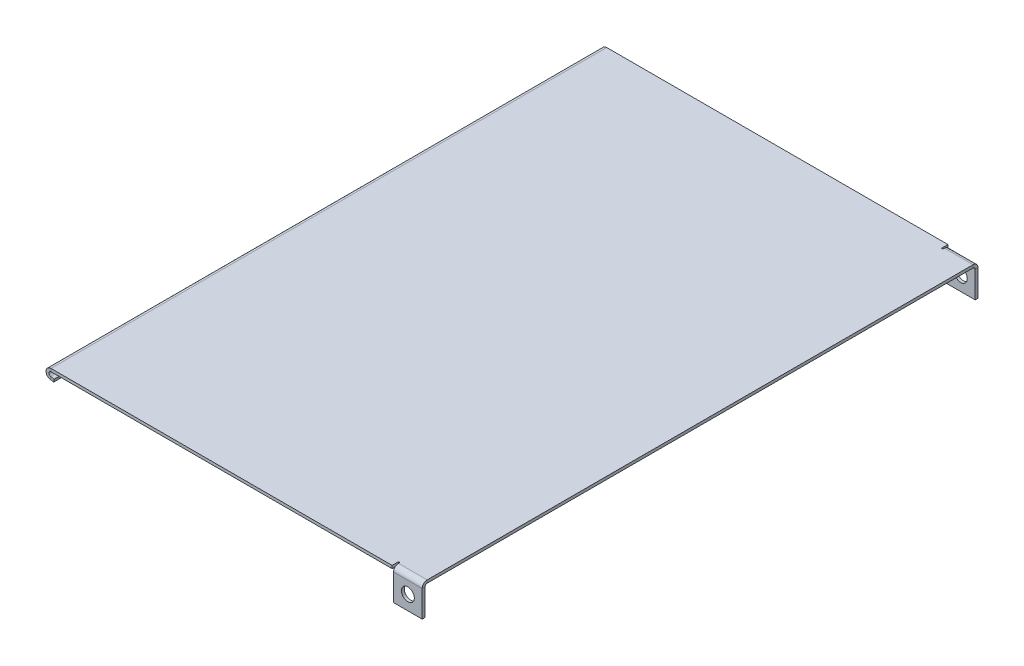
ISO-10303-21;
HEADER;
FILE_DESCRIPTION(('STEP AP214'),'2;1');
FILE_NAME('part.step','',(''),(''),'','','');
FILE_SCHEMA(('AUTOMOTIVE_DESIGN { 1 0 10303 214 1 1 1 1 }'));
ENDSEC;
DATA;
#1=APPLICATION_CONTEXT('core data for automotive mechanical design processes');
#2=APPLICATION_PROTOCOL_DEFINITION('international standard','automotive_design',2000,#1);
#3=PRODUCT_CONTEXT('',#1,'mechanical');
#4=PRODUCT('Part','Part','',(#3));
#5=PRODUCT_RELATED_PRODUCT_CATEGORY('part','',(#4));
#6=PRODUCT_DEFINITION_FORMATION('','',#4);
#7=PRODUCT_DEFINITION_CONTEXT('part definition',#1,'design');
#8=PRODUCT_DEFINITION('design','',#6,#7);
#9=PRODUCT_DEFINITION_SHAPE('','',#8);
#10=(LENGTH_UNIT() NAMED_UNIT(*) SI_UNIT(.MILLI.,.METRE.));
#11=(NAMED_UNIT(*) PLANE_ANGLE_UNIT() SI_UNIT($,.RADIAN.));
#12=(NAMED_UNIT(*) SI_UNIT($,.STERADIAN.) SOLID_ANGLE_UNIT());
#13=UNCERTAINTY_MEASURE_WITH_UNIT(LENGTH_MEASURE(1.E-05),#10,'distance_accuracy_value','');
#14=(GEOMETRIC_REPRESENTATION_CONTEXT(3) GLOBAL_UNCERTAINTY_ASSIGNED_CONTEXT((#13)) GLOBAL_UNIT_ASSIGNED_CONTEXT((#10,
#11,#12)) REPRESENTATION_CONTEXT('',''));
#15=CARTESIAN_POINT('',(0.,0.,0.));
#16=DIRECTION('',(0.,0.,1.));
#17=DIRECTION('',(1.,0.,0.));
#18=AXIS2_PLACEMENT_3D('',#15,#16,#17);
#19=CARTESIAN_POINT('',(0.,-1.,0.));
#20=DIRECTION('',(0.,1.,0.));
#21=DIRECTION('',(0.,0.,1.));
#22=AXIS2_PLACEMENT_3D('',#19,#20,#21);
#23=PLANE('',#22);
#24=DIRECTION('',(0.,0.,-1.));
#25=VECTOR('',#24,1.);
#26=CARTESIAN_POINT('',(54.5,-0.999999999999986,97.));
#27=LINE('',#26,#25);
#28=CARTESIAN_POINT('',(54.5,-0.999999999999986,97.));
#29=VERTEX_POINT('',#28);
#30=CARTESIAN_POINT('',(54.5,-0.999999999999973,94.7634));
#31=VERTEX_POINT('',#30);
#32=EDGE_CURVE('E330',#29,#31,#27,.T.);
#33=ORIENTED_EDGE('',*,*,#32,.F.);
#34=DIRECTION('',(1.,0.,0.));
#35=VECTOR('',#34,1.);
#36=CARTESIAN_POINT('',(-65.,-1.,97.));
#37=LINE('',#36,#35);
#38=CARTESIAN_POINT('',(-64.580623473786,-0.999999999999977,97.));
#39=VERTEX_POINT('',#38);
#40=EDGE_CURVE('E475',#39,#29,#37,.T.);
#41=ORIENTED_EDGE('',*,*,#40,.F.);
#42=DIRECTION('',(0.,0.,-1.));
#43=VECTOR('',#42,1.);
#44=CARTESIAN_POINT('',(-64.580623473786,-0.999999999999977,-97.));
#45=LINE('',#44,#43);
#46=CARTESIAN_POINT('',(-64.580623473786,-0.999999999999977,-96.9999999999999));
#47=VERTEX_POINT('',#46);
#48=EDGE_CURVE('E461',#47,#39,#45,.F.);
#49=ORIENTED_EDGE('',*,*,#48,.F.);
#50=DIRECTION('',(-1.,0.,0.));
#51=VECTOR('',#50,1.);
#52=CARTESIAN_POINT('',(-65.,-1.,-97.));
#53=LINE('',#52,#51);
#54=CARTESIAN_POINT('',(54.5,-1.,-97.));
#55=VERTEX_POINT('',#54);
#56=EDGE_CURVE('E472',#55,#47,#53,.T.);
#57=ORIENTED_EDGE('',*,*,#56,.F.);
#58=DIRECTION('',(0.,0.,-1.));
#59=VECTOR('',#58,1.);
#60=CARTESIAN_POINT('',(54.5,-1.00000000000001,-94.7634));
#61=LINE('',#60,#59);
#62=CARTESIAN_POINT('',(54.5,-1.00000000000001,-94.7634));
#63=VERTEX_POINT('',#62);
#64=EDGE_CURVE('E412',#63,#55,#61,.T.);
#65=ORIENTED_EDGE('',*,*,#64,.F.);
#66=DIRECTION('',(-1.,0.,0.));
#67=VECTOR('',#66,1.);
#68=CARTESIAN_POINT('',(55.,-1.00000000000001,-94.7634));
#69=LINE('',#68,#67);
#70=CARTESIAN_POINT('',(55.,-1.00000000000001,-94.7634));
#71=VERTEX_POINT('',#70);
#72=EDGE_CURVE('E408',#71,#63,#69,.T.);
#73=ORIENTED_EDGE('',*,*,#72,.F.);
#74=DIRECTION('',(0.,0.,1.));
#75=VECTOR('',#74,1.);
#76=CARTESIAN_POINT('',(55.,-1.00000000000001,-95.2634));
#77=LINE('',#76,#75);
#78=CARTESIAN_POINT('',(55.,-1.00000000000001,-95.2634));
#79=VERTEX_POINT('',#78);
#80=EDGE_CURVE('E404',#79,#71,#77,.T.);
#81=ORIENTED_EDGE('',*,*,#80,.F.);
#82=DIRECTION('',(1.,0.,0.));
#83=VECTOR('',#82,1.);
#84=CARTESIAN_POINT('',(65.,-1.00000000000002,-95.2634));
#85=LINE('',#84,#83);
#86=CARTESIAN_POINT('',(65.,-1.00000000000002,-95.2634));
#87=VERTEX_POINT('',#86);
#88=EDGE_CURVE('E394',#87,#79,#85,.F.);
#89=ORIENTED_EDGE('',*,*,#88,.F.);
#90=DIRECTION('',(0.,0.,-1.));
#91=VECTOR('',#90,1.);
#92=CARTESIAN_POINT('',(65.,-1.,-97.));
#93=LINE('',#92,#91);
#94=CARTESIAN_POINT('',(65.,-0.999999999999987,95.2634));
#95=VERTEX_POINT('',#94);
#96=EDGE_CURVE('E470',#95,#87,#93,.T.);
#97=ORIENTED_EDGE('',*,*,#96,.F.);
#98=DIRECTION('',(-1.,0.,0.));
#99=VECTOR('',#98,1.);
#100=CARTESIAN_POINT('',(55.,-0.999999999999973,95.2634));
#101=LINE('',#100,#99);
#102=CARTESIAN_POINT('',(55.,-0.999999999999973,95.2634));
#103=VERTEX_POINT('',#102);
#104=EDGE_CURVE('E319',#103,#95,#101,.F.);
#105=ORIENTED_EDGE('',*,*,#104,.F.);
#106=DIRECTION('',(0.,0.,1.));
#107=VECTOR('',#106,1.);
#108=CARTESIAN_POINT('',(55.,-0.999999999999973,94.7634));
#109=LINE('',#108,#107);
#110=CARTESIAN_POINT('',(55.,-0.999999999999973,94.7634));
#111=VERTEX_POINT('',#110);
#112=EDGE_CURVE('E338',#111,#103,#109,.T.);
#113=ORIENTED_EDGE('',*,*,#112,.F.);
#114=DIRECTION('',(1.,0.,0.));
#115=VECTOR('',#114,1.);
#116=CARTESIAN_POINT('',(54.5,-0.999999999999973,94.7634));
#117=LINE('',#116,#115);
#118=EDGE_CURVE('E334',#31,#111,#117,.T.);
#119=ORIENTED_EDGE('',*,*,#118,.F.);
#120=EDGE_LOOP('',(#33,#41,#49,#57,#65,#73,#81,#89,#97,#105,#113,#119));
#121=FACE_BOUND('',#120,.T.);
#122=ADVANCED_FACE('F101',(#121),#23,.F.);
#123=CARTESIAN_POINT('',(0.,0.,0.));
#124=DIRECTION('',(0.,1.,0.));
#125=DIRECTION('',(0.,0.,1.));
#126=AXIS2_PLACEMENT_3D('',#123,#124,#125);
#127=PLANE('',#126);
#128=DIRECTION('',(1.,0.,0.));
#129=VECTOR('',#128,1.);
#130=CARTESIAN_POINT('',(-65.,0.,97.));
#131=LINE('',#130,#129);
#132=CARTESIAN_POINT('',(-64.580623473786,0.,97.));
#133=VERTEX_POINT('',#132);
#134=CARTESIAN_POINT('',(54.5,0.,97.));
#135=VERTEX_POINT('',#134);
#136=EDGE_CURVE('E473',#133,#135,#131,.T.);
#137=ORIENTED_EDGE('',*,*,#136,.T.);
#138=DIRECTION('',(0.,0.,-1.));
#139=VECTOR('',#138,1.);
#140=CARTESIAN_POINT('',(54.4999999999997,0.,-1.69082409801903E-13));
#141=LINE('',#140,#139);
#142=CARTESIAN_POINT('',(54.5,0.,94.7634));
#143=VERTEX_POINT('',#142);
#144=EDGE_CURVE('E117',#135,#143,#141,.T.);
#145=ORIENTED_EDGE('',*,*,#144,.T.);
#146=DIRECTION('',(1.,0.,0.));
#147=VECTOR('',#146,1.);
#148=CARTESIAN_POINT('',(0.,0.,94.7634));
#149=LINE('',#148,#147);
#150=CARTESIAN_POINT('',(55.,0.,94.7634));
#151=VERTEX_POINT('',#150);
#152=EDGE_CURVE('E13',#143,#151,#149,.T.);
#153=ORIENTED_EDGE('',*,*,#152,.T.);
#154=DIRECTION('',(0.,0.,1.));
#155=VECTOR('',#154,1.);
#156=CARTESIAN_POINT('',(55.,0.,0.));
#157=LINE('',#156,#155);
#158=CARTESIAN_POINT('',(55.,0.,95.2634));
#159=VERTEX_POINT('',#158);
#160=EDGE_CURVE('E110',#151,#159,#157,.T.);
#161=ORIENTED_EDGE('',*,*,#160,.T.);
#162=DIRECTION('',(-1.,0.,0.));
#163=VECTOR('',#162,1.);
#164=CARTESIAN_POINT('',(55.,0.,95.2634));
#165=LINE('',#164,#163);
#166=CARTESIAN_POINT('',(65.,0.,95.2634));
#167=VERTEX_POINT('',#166);
#168=EDGE_CURVE('E306',#159,#167,#165,.F.);
#169=ORIENTED_EDGE('',*,*,#168,.T.);
#170=DIRECTION('',(0.,0.,-1.));
#171=VECTOR('',#170,1.);
#172=CARTESIAN_POINT('',(65.,0.,-97.));
#173=LINE('',#172,#171);
#174=CARTESIAN_POINT('',(65.,0.,-95.2634));
#175=VERTEX_POINT('',#174);
#176=EDGE_CURVE('E467',#167,#175,#173,.T.);
#177=ORIENTED_EDGE('',*,*,#176,.T.);
#178=DIRECTION('',(1.,0.,0.));
#179=VECTOR('',#178,1.);
#180=CARTESIAN_POINT('',(65.,0.,-95.2634));
#181=LINE('',#180,#179);
#182=CARTESIAN_POINT('',(55.,0.,-95.2634));
#183=VERTEX_POINT('',#182);
#184=EDGE_CURVE('E381',#175,#183,#181,.F.);
#185=ORIENTED_EDGE('',*,*,#184,.T.);
#186=DIRECTION('',(0.,0.,1.));
#187=VECTOR('',#186,1.);
#188=CARTESIAN_POINT('',(55.,0.,0.));
#189=LINE('',#188,#187);
#190=CARTESIAN_POINT('',(55.,0.,-94.7634));
#191=VERTEX_POINT('',#190);
#192=EDGE_CURVE('E489',#183,#191,#189,.T.);
#193=ORIENTED_EDGE('',*,*,#192,.T.);
#194=DIRECTION('',(-1.,0.,0.));
#195=VECTOR('',#194,1.);
#196=CARTESIAN_POINT('',(0.,0.,-94.7634));
#197=LINE('',#196,#195);
#198=CARTESIAN_POINT('',(54.5,0.,-94.7634));
#199=VERTEX_POINT('',#198);
#200=EDGE_CURVE('E486',#191,#199,#197,.T.);
#201=ORIENTED_EDGE('',*,*,#200,.T.);
#202=DIRECTION('',(0.,0.,-1.));
#203=VECTOR('',#202,1.);
#204=CARTESIAN_POINT('',(54.5,0.,0.));
#205=LINE('',#204,#203);
#206=CARTESIAN_POINT('',(54.5,0.,-97.));
#207=VERTEX_POINT('',#206);
#208=EDGE_CURVE('E478',#199,#207,#205,.T.);
#209=ORIENTED_EDGE('',*,*,#208,.T.);
#210=DIRECTION('',(-1.,0.,0.));
#211=VECTOR('',#210,1.);
#212=CARTESIAN_POINT('',(-65.,0.,-97.));
#213=LINE('',#212,#211);
#214=CARTESIAN_POINT('',(-64.5806234737861,0.,-96.9999999999999));
#215=VERTEX_POINT('',#214);
#216=EDGE_CURVE('E480',#207,#215,#213,.T.);
#217=ORIENTED_EDGE('',*,*,#216,.T.);
#218=DIRECTION('',(0.,0.,-1.));
#219=VECTOR('',#218,1.);
#220=CARTESIAN_POINT('',(-64.5806234737861,0.,-97.));
#221=LINE('',#220,#219);
#222=EDGE_CURVE('E450',#215,#133,#221,.F.);
#223=ORIENTED_EDGE('',*,*,#222,.T.);
#224=EDGE_LOOP('',(#137,#145,#153,#161,#169,#177,#185,#193,#201,#209,#217,#223));
#225=FACE_BOUND('',#224,.T.);
#226=ADVANCED_FACE('F496',(#225),#127,.T.);
#227=CARTESIAN_POINT('',(-65.,-1.,97.));
#228=DIRECTION('',(0.,0.,1.));
#229=DIRECTION('',(1.,0.,0.));
#230=AXIS2_PLACEMENT_3D('',#227,#228,#229);
#231=PLANE('',#230);
#232=ORIENTED_EDGE('',*,*,#40,.T.);
#233=DIRECTION('',(0.,1.,0.));
#234=VECTOR('',#233,1.);
#235=CARTESIAN_POINT('',(54.5,-0.999999999999986,97.));
#236=LINE('',#235,#234);
#237=EDGE_CURVE('E333',#29,#135,#236,.T.);
#238=ORIENTED_EDGE('',*,*,#237,.T.);
#239=ORIENTED_EDGE('',*,*,#136,.F.);
#240=DIRECTION('',(0.,1.,0.));
#241=VECTOR('',#240,1.);
#242=CARTESIAN_POINT('',(-64.580623473786,-0.999999999999977,97.));
#243=LINE('',#242,#241);
#244=EDGE_CURVE('E465',#39,#133,#243,.T.);
#245=ORIENTED_EDGE('',*,*,#244,.F.);
#246=EDGE_LOOP('',(#232,#238,#239,#245));
#247=FACE_BOUND('',#246,.T.);
#248=ADVANCED_FACE('F570',(#247),#231,.T.);
#249=CARTESIAN_POINT('',(-65.,-1.,-97.));
#250=DIRECTION('',(0.,0.,-1.));
#251=DIRECTION('',(-1.,0.,0.));
#252=AXIS2_PLACEMENT_3D('',#249,#250,#251);
#253=PLANE('',#252);
#254=ORIENTED_EDGE('',*,*,#216,.F.);
#255=DIRECTION('',(0.,1.,0.));
#256=VECTOR('',#255,1.);
#257=CARTESIAN_POINT('',(54.5,-1.,-97.));
#258=LINE('',#257,#256);
#259=EDGE_CURVE('E414',#55,#207,#258,.T.);
#260=ORIENTED_EDGE('',*,*,#259,.F.);
#261=ORIENTED_EDGE('',*,*,#56,.T.);
#262=DIRECTION('',(0.,1.,0.));
#263=VECTOR('',#262,1.);
#264=CARTESIAN_POINT('',(-64.580623473786,-0.999999999999977,-96.9999999999999));
#265=LINE('',#264,#263);
#266=EDGE_CURVE('E455',#47,#215,#265,.T.);
#267=ORIENTED_EDGE('',*,*,#266,.T.);
#268=EDGE_LOOP('',(#254,#260,#261,#267));
#269=FACE_BOUND('',#268,.T.);
#270=ADVANCED_FACE('F577',(#269),#253,.T.);
#271=CARTESIAN_POINT('',(65.,-1.,-97.));
#272=DIRECTION('',(1.,0.,0.));
#273=DIRECTION('',(0.,0.,-1.));
#274=AXIS2_PLACEMENT_3D('',#271,#272,#273);
#275=PLANE('',#274);
#276=DIRECTION('',(0.,1.,0.));
#277=VECTOR('',#276,1.);
#278=CARTESIAN_POINT('',(65.,-0.999999999999987,95.2634));
#279=LINE('',#278,#277);
#280=EDGE_CURVE('E324',#95,#167,#279,.T.);
#281=ORIENTED_EDGE('',*,*,#280,.F.);
#282=ORIENTED_EDGE('',*,*,#96,.T.);
#283=DIRECTION('',(0.,1.,0.));
#284=VECTOR('',#283,1.);
#285=CARTESIAN_POINT('',(65.,-1.00000000000002,-95.2634));
#286=LINE('',#285,#284);
#287=EDGE_CURVE('E388',#87,#175,#286,.T.);
#288=ORIENTED_EDGE('',*,*,#287,.T.);
#289=ORIENTED_EDGE('',*,*,#176,.F.);
#290=EDGE_LOOP('',(#281,#282,#288,#289));
#291=FACE_BOUND('',#290,.T.);
#292=ADVANCED_FACE('F103',(#291),#275,.T.);
#293=CARTESIAN_POINT('',(-64.580623473786,-1.73659999999999,97.));
#294=DIRECTION('',(0.,0.,1.));
#295=DIRECTION('',(1.,0.,0.));
#296=AXIS2_PLACEMENT_3D('',#293,#294,#295);
#297=PLANE('',#296);
#298=DIRECTION('',(0.173648177666931,0.984807753012208,0.));
#299=VECTOR('',#298,1.);
#300=CARTESIAN_POINT('',(-64.8821808991224,-3.446817143881,97.));
#301=LINE('',#300,#299);
#302=CARTESIAN_POINT('',(-64.7085327214555,-2.46200939086879,97.));
#303=VERTEX_POINT('',#302);
#304=CARTESIAN_POINT('',(-64.8821808991224,-3.446817143881,97.));
#305=VERTEX_POINT('',#304);
#306=EDGE_CURVE('E407',#303,#305,#301,.F.);
#307=ORIENTED_EDGE('',*,*,#306,.F.);
#308=CARTESIAN_POINT('',(-64.580623473786,-1.73659999999999,97.));
#309=DIRECTION('',(0.,0.,-1.));
#310=DIRECTION('',(-1.,0.,0.));
#311=AXIS2_PLACEMENT_3D('',#308,#309,#310);
#312=CIRCLE('',#311,0.736600000000011);
#313=EDGE_CURVE('E458',#39,#303,#312,.F.);
#314=ORIENTED_EDGE('',*,*,#313,.F.);
#315=ORIENTED_EDGE('',*,*,#244,.T.);
#316=CARTESIAN_POINT('',(-64.580623473786,-1.73659999999999,97.));
#317=DIRECTION('',(0.,0.,-1.));
#318=DIRECTION('',(-1.,0.,0.));
#319=AXIS2_PLACEMENT_3D('',#316,#317,#318);
#320=CIRCLE('',#319,1.73660000000001);
#321=EDGE_CURVE('E125',#133,#305,#320,.F.);
#322=ORIENTED_EDGE('',*,*,#321,.T.);
#323=EDGE_LOOP('',(#307,#314,#315,#322));
#324=FACE_BOUND('',#323,.T.);
#325=ADVANCED_FACE('F584',(#324),#297,.T.);
#326=CARTESIAN_POINT('',(-64.580623473786,-1.73659999999999,-96.9999999999999));
#327=DIRECTION('',(0.,0.,1.));
#328=DIRECTION('',(1.,0.,0.));
#329=AXIS2_PLACEMENT_3D('',#326,#327,#328);
#330=PLANE('',#329);
#331=CARTESIAN_POINT('',(-64.580623473786,-1.73659999999999,-96.9999999999999));
#332=DIRECTION('',(0.,0.,-1.));
#333=DIRECTION('',(-1.,0.,0.));
#334=AXIS2_PLACEMENT_3D('',#331,#332,#333);
#335=CIRCLE('',#334,0.736600000000011);
#336=CARTESIAN_POINT('',(-64.7085327214555,-2.46200939086879,-96.9999999999999));
#337=VERTEX_POINT('',#336);
#338=EDGE_CURVE('E423',#337,#47,#335,.T.);
#339=ORIENTED_EDGE('',*,*,#338,.F.);
#340=DIRECTION('',(0.173648177666931,0.984807753012208,0.));
#341=VECTOR('',#340,1.);
#342=CARTESIAN_POINT('',(-64.7085327214555,-2.4620093908688,-96.9999999999999));
#343=LINE('',#342,#341);
#344=CARTESIAN_POINT('',(-64.8821808991225,-3.446817143881,-96.9999999999999));
#345=VERTEX_POINT('',#344);
#346=EDGE_CURVE('E443',#337,#345,#343,.F.);
#347=ORIENTED_EDGE('',*,*,#346,.T.);
#348=CARTESIAN_POINT('',(-64.580623473786,-1.73659999999999,-96.9999999999999));
#349=DIRECTION('',(0.,0.,-1.));
#350=DIRECTION('',(-1.,0.,0.));
#351=AXIS2_PLACEMENT_3D('',#348,#349,#350);
#352=CIRCLE('',#351,1.73660000000001);
#353=EDGE_CURVE('E453',#345,#215,#352,.T.);
#354=ORIENTED_EDGE('',*,*,#353,.T.);
#355=ORIENTED_EDGE('',*,*,#266,.F.);
#356=EDGE_LOOP('',(#339,#347,#354,#355));
#357=FACE_BOUND('',#356,.T.);
#358=ADVANCED_FACE('F573',(#357),#330,.F.);
#359=CARTESIAN_POINT('',(-64.580623473786,-1.73659999999999,-97.));
#360=DIRECTION('',(0.,0.,-1.));
#361=DIRECTION('',(-0.173648177666931,-0.984807753012208,0.));
#362=AXIS2_PLACEMENT_3D('',#359,#360,#361);
#363=CYLINDRICAL_SURFACE('',#362,1.73660000000001);
#364=ORIENTED_EDGE('',*,*,#222,.F.);
#365=ORIENTED_EDGE('',*,*,#353,.F.);
#366=DIRECTION('',(0.,0.,-1.));
#367=VECTOR('',#366,1.);
#368=CARTESIAN_POINT('',(-64.8821808991224,-3.446817143881,97.));
#369=LINE('',#368,#367);
#370=EDGE_CURVE('E441',#345,#305,#369,.F.);
#371=ORIENTED_EDGE('',*,*,#370,.T.);
#372=ORIENTED_EDGE('',*,*,#321,.F.);
#373=EDGE_LOOP('',(#364,#365,#371,#372));
#374=FACE_BOUND('',#373,.T.);
#375=ADVANCED_FACE('F590',(#374),#363,.T.);
#376=CARTESIAN_POINT('',(-64.580623473786,-1.73659999999999,-97.));
#377=DIRECTION('',(0.,0.,-1.));
#378=DIRECTION('',(-0.173648177666931,-0.984807753012208,0.));
#379=AXIS2_PLACEMENT_3D('',#376,#377,#378);
#380=CYLINDRICAL_SURFACE('',#379,0.736600000000011);
#381=ORIENTED_EDGE('',*,*,#48,.T.);
#382=ORIENTED_EDGE('',*,*,#313,.T.);
#383=DIRECTION('',(0.,0.,-1.));
#384=VECTOR('',#383,1.);
#385=CARTESIAN_POINT('',(-64.7085327214555,-2.4620093908688,97.));
#386=LINE('',#385,#384);
#387=EDGE_CURVE('E446',#303,#337,#386,.T.);
#388=ORIENTED_EDGE('',*,*,#387,.T.);
#389=ORIENTED_EDGE('',*,*,#338,.T.);
#390=EDGE_LOOP('',(#381,#382,#388,#389));
#391=FACE_BOUND('',#390,.T.);
#392=ADVANCED_FACE('F616',(#391),#380,.F.);
#393=CARTESIAN_POINT('',(-63.6379747839668,-3.66620425154541,-97.));
#394=DIRECTION('',(0.,0.,1.));
#395=DIRECTION('',(0.,-1.,0.));
#396=AXIS2_PLACEMENT_3D('',#393,#394,#395);
#397=PLANE('',#396);
#398=ORIENTED_EDGE('',*,*,#346,.F.);
#399=DIRECTION('',(-0.984807753012208,0.173648177666931,0.));
#400=VECTOR('',#399,1.);
#401=CARTESIAN_POINT('',(-63.4643266062999,-2.6813964985332,-97.));
#402=LINE('',#401,#400);
#403=CARTESIAN_POINT('',(-63.4643266062999,-2.6813964985332,-96.9999999999999));
#404=VERTEX_POINT('',#403);
#405=EDGE_CURVE('E439',#337,#404,#402,.F.);
#406=ORIENTED_EDGE('',*,*,#405,.T.);
#407=DIRECTION('',(0.173648177666931,0.984807753012208,0.));
#408=VECTOR('',#407,1.);
#409=CARTESIAN_POINT('',(-63.6379747839668,-3.66620425154541,-96.9999999999999));
#410=LINE('',#409,#408);
#411=CARTESIAN_POINT('',(-63.6379747839668,-3.66620425154541,-96.9999999999999));
#412=VERTEX_POINT('',#411);
#413=EDGE_CURVE('E420',#412,#404,#410,.T.);
#414=ORIENTED_EDGE('',*,*,#413,.F.);
#415=DIRECTION('',(0.984807753012208,-0.173648177666931,0.));
#416=VECTOR('',#415,1.);
#417=CARTESIAN_POINT('',(-10.3046480737878,-13.0703087214894,-97.));
#418=LINE('',#417,#416);
#419=EDGE_CURVE('E432',#345,#412,#418,.T.);
#420=ORIENTED_EDGE('',*,*,#419,.F.);
#421=EDGE_LOOP('',(#398,#406,#414,#420));
#422=FACE_BOUND('',#421,.T.);
#423=ADVANCED_FACE('F602',(#422),#397,.F.);
#424=CARTESIAN_POINT('',(-73.1736481776669,-1.98480775301221,97.));
#425=DIRECTION('',(0.,0.,-1.));
#426=DIRECTION('',(-1.,0.,0.));
#427=AXIS2_PLACEMENT_3D('',#424,#425,#426);
#428=PLANE('',#427);
#429=ORIENTED_EDGE('',*,*,#306,.T.);
#430=DIRECTION('',(-0.984807753012208,0.173648177666931,0.));
#431=VECTOR('',#430,1.);
#432=CARTESIAN_POINT('',(-10.3046480737879,-13.0703087214894,97.0000000000001));
#433=LINE('',#432,#431);
#434=CARTESIAN_POINT('',(-63.6379747839668,-3.66620425154541,97.));
#435=VERTEX_POINT('',#434);
#436=EDGE_CURVE('E427',#435,#305,#433,.T.);
#437=ORIENTED_EDGE('',*,*,#436,.F.);
#438=DIRECTION('',(0.173648177666931,0.984807753012208,0.));
#439=VECTOR('',#438,1.);
#440=CARTESIAN_POINT('',(-63.6379747839668,-3.66620425154541,97.));
#441=LINE('',#440,#439);
#442=CARTESIAN_POINT('',(-63.4643266062998,-2.6813964985332,97.));
#443=VERTEX_POINT('',#442);
#444=EDGE_CURVE('E424',#435,#443,#441,.T.);
#445=ORIENTED_EDGE('',*,*,#444,.T.);
#446=DIRECTION('',(0.984807753012208,-0.173648177666931,0.));
#447=VECTOR('',#446,1.);
#448=CARTESIAN_POINT('',(-73.,-1.,97.));
#449=LINE('',#448,#447);
#450=EDGE_CURVE('E434',#443,#303,#449,.F.);
#451=ORIENTED_EDGE('',*,*,#450,.T.);
#452=EDGE_LOOP('',(#429,#437,#445,#451));
#453=FACE_BOUND('',#452,.T.);
#454=ADVANCED_FACE('F610',(#453),#428,.F.);
#455=CARTESIAN_POINT('',(-10.3046480737878,-13.0703087214894,0.));
#456=DIRECTION('',(0.173648177666931,0.984807753012208,0.));
#457=DIRECTION('',(-0.984807753012208,0.173648177666931,0.));
#458=AXIS2_PLACEMENT_3D('',#455,#456,#457);
#459=PLANE('',#458);
#460=ORIENTED_EDGE('',*,*,#370,.F.);
#461=ORIENTED_EDGE('',*,*,#419,.T.);
#462=DIRECTION('',(0.,0.,1.));
#463=VECTOR('',#462,1.);
#464=CARTESIAN_POINT('',(-63.6379747839668,-3.66620425154541,0.));
#465=LINE('',#464,#463);
#466=EDGE_CURVE('E430',#412,#435,#465,.T.);
#467=ORIENTED_EDGE('',*,*,#466,.T.);
#468=ORIENTED_EDGE('',*,*,#436,.T.);
#469=EDGE_LOOP('',(#460,#461,#467,#468));
#470=FACE_BOUND('',#469,.T.);
#471=ADVANCED_FACE('F599',(#470),#459,.F.);
#472=CARTESIAN_POINT('',(-10.1309998961208,-12.0855009684772,0.));
#473=DIRECTION('',(0.173648177666931,0.984807753012208,0.));
#474=DIRECTION('',(-0.984807753012208,0.173648177666931,0.));
#475=AXIS2_PLACEMENT_3D('',#472,#473,#474);
#476=PLANE('',#475);
#477=ORIENTED_EDGE('',*,*,#405,.F.);
#478=ORIENTED_EDGE('',*,*,#387,.F.);
#479=ORIENTED_EDGE('',*,*,#450,.F.);
#480=DIRECTION('',(0.,0.,-1.));
#481=VECTOR('',#480,1.);
#482=CARTESIAN_POINT('',(-63.4643266062998,-2.6813964985332,97.));
#483=LINE('',#482,#481);
#484=EDGE_CURVE('E437',#404,#443,#483,.F.);
#485=ORIENTED_EDGE('',*,*,#484,.F.);
#486=EDGE_LOOP('',(#477,#478,#479,#485));
#487=FACE_BOUND('',#486,.T.);
#488=ADVANCED_FACE('F619',(#487),#476,.T.);
#489=CARTESIAN_POINT('',(-63.6379747839668,-3.66620425154541,97.));
#490=DIRECTION('',(-0.984807753012208,0.173648177666931,0.));
#491=DIRECTION('',(-0.173648177666931,-0.984807753012208,0.));
#492=AXIS2_PLACEMENT_3D('',#489,#490,#491);
#493=PLANE('',#492);
#494=ORIENTED_EDGE('',*,*,#484,.T.);
#495=ORIENTED_EDGE('',*,*,#444,.F.);
#496=ORIENTED_EDGE('',*,*,#466,.F.);
#497=ORIENTED_EDGE('',*,*,#413,.T.);
#498=EDGE_LOOP('',(#494,#495,#496,#497));
#499=FACE_BOUND('',#498,.T.);
#500=ADVANCED_FACE('F607',(#499),#493,.F.);
#501=CARTESIAN_POINT('',(55.,-1.00000000000001,-95.2634));
#502=DIRECTION('',(-1.,0.,0.));
#503=DIRECTION('',(0.,0.,1.));
#504=AXIS2_PLACEMENT_3D('',#501,#502,#503);
#505=PLANE('',#504);
#506=ORIENTED_EDGE('',*,*,#192,.F.);
#507=DIRECTION('',(0.,1.,0.));
#508=VECTOR('',#507,1.);
#509=CARTESIAN_POINT('',(55.,-1.00000000000001,-95.2634));
#510=LINE('',#509,#508);
#511=EDGE_CURVE('E398',#79,#183,#510,.T.);
#512=ORIENTED_EDGE('',*,*,#511,.F.);
#513=ORIENTED_EDGE('',*,*,#80,.T.);
#514=DIRECTION('',(0.,1.,0.));
#515=VECTOR('',#514,1.);
#516=CARTESIAN_POINT('',(55.,-1.00000000000001,-94.7634));
#517=LINE('',#516,#515);
#518=EDGE_CURVE('E411',#71,#191,#517,.T.);
#519=ORIENTED_EDGE('',*,*,#518,.T.);
#520=EDGE_LOOP('',(#506,#512,#513,#519));
#521=FACE_BOUND('',#520,.T.);
#522=ADVANCED_FACE('F626',(#521),#505,.T.);
#523=CARTESIAN_POINT('',(55.,-1.00000000000001,-94.7634));
#524=DIRECTION('',(0.,0.,-1.));
#525=DIRECTION('',(0.,1.,0.));
#526=AXIS2_PLACEMENT_3D('',#523,#524,#525);
#527=PLANE('',#526);
#528=ORIENTED_EDGE('',*,*,#200,.F.);
#529=ORIENTED_EDGE('',*,*,#518,.F.);
#530=ORIENTED_EDGE('',*,*,#72,.T.);
#531=DIRECTION('',(0.,1.,0.));
#532=VECTOR('',#531,1.);
#533=CARTESIAN_POINT('',(54.5,-1.00000000000001,-94.7634));
#534=LINE('',#533,#532);
#535=EDGE_CURVE('E401',#63,#199,#534,.T.);
#536=ORIENTED_EDGE('',*,*,#535,.T.);
#537=EDGE_LOOP('',(#528,#529,#530,#536));
#538=FACE_BOUND('',#537,.T.);
#539=ADVANCED_FACE('F692',(#538),#527,.T.);
#540=CARTESIAN_POINT('',(54.5,-1.00000000000001,-94.7634));
#541=DIRECTION('',(1.,0.,0.));
#542=DIRECTION('',(0.,0.,-1.));
#543=AXIS2_PLACEMENT_3D('',#540,#541,#542);
#544=PLANE('',#543);
#545=ORIENTED_EDGE('',*,*,#208,.F.);
#546=ORIENTED_EDGE('',*,*,#535,.F.);
#547=ORIENTED_EDGE('',*,*,#64,.T.);
#548=ORIENTED_EDGE('',*,*,#259,.T.);
#549=EDGE_LOOP('',(#545,#546,#547,#548));
#550=FACE_BOUND('',#549,.T.);
#551=ADVANCED_FACE('F702',(#550),#544,.T.);
#552=CARTESIAN_POINT('',(55.,-1.73660000000001,-95.2634));
#553=DIRECTION('',(-1.,0.,0.));
#554=DIRECTION('',(0.,-1.,0.));
#555=AXIS2_PLACEMENT_3D('',#552,#553,#554);
#556=PLANE('',#555);
#557=DIRECTION('',(0.,0.,1.));
#558=VECTOR('',#557,1.);
#559=CARTESIAN_POINT('',(55.,-1.7366,-97.));
#560=LINE('',#559,#558);
#561=CARTESIAN_POINT('',(55.,-1.73660000000001,-96.));
#562=VERTEX_POINT('',#561);
#563=CARTESIAN_POINT('',(55.,-1.7366,-97.));
#564=VERTEX_POINT('',#563);
#565=EDGE_CURVE('E378',#562,#564,#560,.F.);
#566=ORIENTED_EDGE('',*,*,#565,.F.);
#567=CARTESIAN_POINT('',(55.,-1.73660000000001,-95.2634));
#568=DIRECTION('',(1.,0.,0.));
#569=DIRECTION('',(0.,1.,0.));
#570=AXIS2_PLACEMENT_3D('',#567,#568,#569);
#571=CIRCLE('',#570,0.736600000000004);
#572=EDGE_CURVE('E391',#79,#562,#571,.F.);
#573=ORIENTED_EDGE('',*,*,#572,.F.);
#574=ORIENTED_EDGE('',*,*,#511,.T.);
#575=CARTESIAN_POINT('',(55.,-1.73660000000001,-95.2634));
#576=DIRECTION('',(1.,0.,0.));
#577=DIRECTION('',(0.,1.,0.));
#578=AXIS2_PLACEMENT_3D('',#575,#576,#577);
#579=CIRCLE('',#578,1.7366);
#580=EDGE_CURVE('E384',#183,#564,#579,.F.);
#581=ORIENTED_EDGE('',*,*,#580,.T.);
#582=EDGE_LOOP('',(#566,#573,#574,#581));
#583=FACE_BOUND('',#582,.T.);
#584=ADVANCED_FACE('F545',(#583),#556,.T.);
#585=CARTESIAN_POINT('',(65.,-1.73660000000002,-95.2634));
#586=DIRECTION('',(-1.,0.,0.));
#587=DIRECTION('',(0.,-1.,0.));
#588=AXIS2_PLACEMENT_3D('',#585,#586,#587);
#589=PLANE('',#588);
#590=CARTESIAN_POINT('',(65.,-1.73660000000002,-95.2634));
#591=DIRECTION('',(1.,0.,0.));
#592=DIRECTION('',(0.,1.,0.));
#593=AXIS2_PLACEMENT_3D('',#590,#591,#592);
#594=CIRCLE('',#593,0.736600000000004);
#595=CARTESIAN_POINT('',(65.,-1.73660000000002,-96.));
#596=VERTEX_POINT('',#595);
#597=EDGE_CURVE('E353',#596,#87,#594,.T.);
#598=ORIENTED_EDGE('',*,*,#597,.F.);
#599=DIRECTION('',(0.,0.,1.));
#600=VECTOR('',#599,1.);
#601=CARTESIAN_POINT('',(65.,-1.73660000000002,-96.));
#602=LINE('',#601,#600);
#603=CARTESIAN_POINT('',(65.,-1.73660000000001,-97.));
#604=VERTEX_POINT('',#603);
#605=EDGE_CURVE('E373',#596,#604,#602,.F.);
#606=ORIENTED_EDGE('',*,*,#605,.T.);
#607=CARTESIAN_POINT('',(65.,-1.73660000000002,-95.2634));
#608=DIRECTION('',(1.,0.,0.));
#609=DIRECTION('',(0.,1.,0.));
#610=AXIS2_PLACEMENT_3D('',#607,#608,#609);
#611=CIRCLE('',#610,1.7366);
#612=EDGE_CURVE('E385',#604,#175,#611,.T.);
#613=ORIENTED_EDGE('',*,*,#612,.T.);
#614=ORIENTED_EDGE('',*,*,#287,.F.);
#615=EDGE_LOOP('',(#598,#606,#613,#614));
#616=FACE_BOUND('',#615,.T.);
#617=ADVANCED_FACE('F524',(#616),#589,.F.);
#618=CARTESIAN_POINT('',(65.,-1.73660000000002,-95.2634));
#619=DIRECTION('',(1.,0.,0.));
#620=DIRECTION('',(0.,0.,-1.));
#621=AXIS2_PLACEMENT_3D('',#618,#619,#620);
#622=CYLINDRICAL_SURFACE('',#621,1.7366);
#623=ORIENTED_EDGE('',*,*,#184,.F.);
#624=ORIENTED_EDGE('',*,*,#612,.F.);
#625=DIRECTION('',(1.,0.,0.));
#626=VECTOR('',#625,1.);
#627=CARTESIAN_POINT('',(55.,-1.7366,-97.));
#628=LINE('',#627,#626);
#629=EDGE_CURVE('E371',#604,#564,#628,.F.);
#630=ORIENTED_EDGE('',*,*,#629,.T.);
#631=ORIENTED_EDGE('',*,*,#580,.F.);
#632=EDGE_LOOP('',(#623,#624,#630,#631));
#633=FACE_BOUND('',#632,.T.);
#634=ADVANCED_FACE('F521',(#633),#622,.T.);
#635=CARTESIAN_POINT('',(65.,-1.73660000000002,-95.2634));
#636=DIRECTION('',(1.,0.,0.));
#637=DIRECTION('',(0.,0.,-1.));
#638=AXIS2_PLACEMENT_3D('',#635,#636,#637);
#639=CYLINDRICAL_SURFACE('',#638,0.736600000000004);
#640=ORIENTED_EDGE('',*,*,#88,.T.);
#641=ORIENTED_EDGE('',*,*,#572,.T.);
#642=DIRECTION('',(1.,0.,0.));
#643=VECTOR('',#642,1.);
#644=CARTESIAN_POINT('',(55.,-1.7366,-96.));
#645=LINE('',#644,#643);
#646=EDGE_CURVE('E376',#562,#596,#645,.T.);
#647=ORIENTED_EDGE('',*,*,#646,.T.);
#648=ORIENTED_EDGE('',*,*,#597,.T.);
#649=EDGE_LOOP('',(#640,#641,#647,#648));
#650=FACE_BOUND('',#649,.T.);
#651=ADVANCED_FACE('F549',(#650),#639,.F.);
#652=CARTESIAN_POINT('',(65.,-11.,-97.));
#653=DIRECTION('',(-1.,0.,0.));
#654=DIRECTION('',(0.,0.,1.));
#655=AXIS2_PLACEMENT_3D('',#652,#653,#654);
#656=PLANE('',#655);
#657=ORIENTED_EDGE('',*,*,#605,.F.);
#658=DIRECTION('',(0.,1.,0.));
#659=VECTOR('',#658,1.);
#660=CARTESIAN_POINT('',(65.,-11.,-96.));
#661=LINE('',#660,#659);
#662=CARTESIAN_POINT('',(65.,-11.,-96.));
#663=VERTEX_POINT('',#662);
#664=EDGE_CURVE('E369',#596,#663,#661,.F.);
#665=ORIENTED_EDGE('',*,*,#664,.T.);
#666=DIRECTION('',(0.,0.,1.));
#667=VECTOR('',#666,1.);
#668=CARTESIAN_POINT('',(65.,-11.,-97.));
#669=LINE('',#668,#667);
#670=CARTESIAN_POINT('',(65.,-11.,-97.));
#671=VERTEX_POINT('',#670);
#672=EDGE_CURVE('E350',#671,#663,#669,.T.);
#673=ORIENTED_EDGE('',*,*,#672,.F.);
#674=DIRECTION('',(0.,-1.,0.));
#675=VECTOR('',#674,1.);
#676=CARTESIAN_POINT('',(65.,4.07335106546244E-13,-97.));
#677=LINE('',#676,#675);
#678=EDGE_CURVE('E362',#604,#671,#677,.T.);
#679=ORIENTED_EDGE('',*,*,#678,.F.);
#680=EDGE_LOOP('',(#657,#665,#673,#679));
#681=FACE_BOUND('',#680,.T.);
#682=ADVANCED_FACE('F534',(#681),#656,.F.);
#683=CARTESIAN_POINT('',(55.,-0.999999999999994,-97.));
#684=DIRECTION('',(1.,0.,0.));
#685=DIRECTION('',(0.,0.,-1.));
#686=AXIS2_PLACEMENT_3D('',#683,#684,#685);
#687=PLANE('',#686);
#688=ORIENTED_EDGE('',*,*,#565,.T.);
#689=DIRECTION('',(0.,1.,0.));
#690=VECTOR('',#689,1.);
#691=CARTESIAN_POINT('',(55.,4.07335106546244E-13,-97.));
#692=LINE('',#691,#690);
#693=CARTESIAN_POINT('',(55.,-11.,-97.));
#694=VERTEX_POINT('',#693);
#695=EDGE_CURVE('E357',#694,#564,#692,.T.);
#696=ORIENTED_EDGE('',*,*,#695,.F.);
#697=DIRECTION('',(0.,0.,1.));
#698=VECTOR('',#697,1.);
#699=CARTESIAN_POINT('',(55.,-11.,-97.));
#700=LINE('',#699,#698);
#701=CARTESIAN_POINT('',(55.,-11.,-96.));
#702=VERTEX_POINT('',#701);
#703=EDGE_CURVE('E354',#694,#702,#700,.T.);
#704=ORIENTED_EDGE('',*,*,#703,.T.);
#705=DIRECTION('',(0.,-1.,0.));
#706=VECTOR('',#705,1.);
#707=CARTESIAN_POINT('',(55.,-0.999999999999998,-96.));
#708=LINE('',#707,#706);
#709=EDGE_CURVE('E364',#702,#562,#708,.F.);
#710=ORIENTED_EDGE('',*,*,#709,.T.);
#711=EDGE_LOOP('',(#688,#696,#704,#710));
#712=FACE_BOUND('',#711,.T.);
#713=ADVANCED_FACE('F542',(#712),#687,.F.);
#714=CARTESIAN_POINT('',(-1.346145417358E-13,4.07335106546243E-13,-96.9999999999999));
#715=DIRECTION('',(0.,0.,1.));
#716=DIRECTION('',(0.,-1.,0.));
#717=AXIS2_PLACEMENT_3D('',#714,#715,#716);
#718=PLANE('',#717);
#719=CARTESIAN_POINT('',(60.,-6.,-96.9999999999999));
#720=DIRECTION('',(0.,0.,-1.));
#721=DIRECTION('',(0.,1.,0.));
#722=AXIS2_PLACEMENT_3D('',#719,#720,#721);
#723=CIRCLE('',#722,2.25);
#724=CARTESIAN_POINT('',(60.,-3.75,-96.9999999999999));
#725=VERTEX_POINT('',#724);
#726=EDGE_CURVE('E346',#725,#725,#723,.T.);
#727=ORIENTED_EDGE('',*,*,#726,.F.);
#728=EDGE_LOOP('',(#727));
#729=FACE_BOUND('',#728,.T.);
#730=ORIENTED_EDGE('',*,*,#629,.F.);
#731=ORIENTED_EDGE('',*,*,#678,.T.);
#732=DIRECTION('',(-1.,0.,0.));
#733=VECTOR('',#732,1.);
#734=CARTESIAN_POINT('',(-1.36522737559375E-13,-11.,-96.9999999999999));
#735=LINE('',#734,#733);
#736=EDGE_CURVE('E360',#671,#694,#735,.T.);
#737=ORIENTED_EDGE('',*,*,#736,.T.);
#738=ORIENTED_EDGE('',*,*,#695,.T.);
#739=EDGE_LOOP('',(#730,#731,#737,#738));
#740=FACE_BOUND('',#739,.T.);
#741=ADVANCED_FACE('F531',(#729,#740),#718,.F.);
#742=CARTESIAN_POINT('',(-1.34293248611046E-13,4.038436252074E-13,-95.9999999999999));
#743=DIRECTION('',(0.,0.,1.));
#744=DIRECTION('',(0.,-1.,0.));
#745=AXIS2_PLACEMENT_3D('',#742,#743,#744);
#746=PLANE('',#745);
#747=CARTESIAN_POINT('',(60.,-6.,-96.));
#748=DIRECTION('',(0.,0.,1.));
#749=DIRECTION('',(0.,-1.,0.));
#750=AXIS2_PLACEMENT_3D('',#747,#748,#749);
#751=CIRCLE('',#750,2.25);
#752=CARTESIAN_POINT('',(60.,-8.24999999999999,-96.));
#753=VERTEX_POINT('',#752);
#754=EDGE_CURVE('E349',#753,#753,#751,.T.);
#755=ORIENTED_EDGE('',*,*,#754,.F.);
#756=EDGE_LOOP('',(#755));
#757=FACE_BOUND('',#756,.T.);
#758=ORIENTED_EDGE('',*,*,#664,.F.);
#759=ORIENTED_EDGE('',*,*,#646,.F.);
#760=ORIENTED_EDGE('',*,*,#709,.F.);
#761=DIRECTION('',(1.,0.,0.));
#762=VECTOR('',#761,1.);
#763=CARTESIAN_POINT('',(55.,-11.,-96.));
#764=LINE('',#763,#762);
#765=EDGE_CURVE('E367',#663,#702,#764,.F.);
#766=ORIENTED_EDGE('',*,*,#765,.F.);
#767=EDGE_LOOP('',(#758,#759,#760,#766));
#768=FACE_BOUND('',#767,.T.);
#769=ADVANCED_FACE('F551',(#757,#768),#746,.T.);
#770=CARTESIAN_POINT('',(55.,-11.,-97.));
#771=DIRECTION('',(0.,1.,0.));
#772=DIRECTION('',(0.,0.,1.));
#773=AXIS2_PLACEMENT_3D('',#770,#771,#772);
#774=PLANE('',#773);
#775=ORIENTED_EDGE('',*,*,#765,.T.);
#776=ORIENTED_EDGE('',*,*,#703,.F.);
#777=ORIENTED_EDGE('',*,*,#736,.F.);
#778=ORIENTED_EDGE('',*,*,#672,.T.);
#779=EDGE_LOOP('',(#775,#776,#777,#778));
#780=FACE_BOUND('',#779,.T.);
#781=ADVANCED_FACE('F539',(#780),#774,.F.);
#782=CARTESIAN_POINT('',(60.,-6.00000000000053,97.));
#783=DIRECTION('',(0.,0.,-1.));
#784=DIRECTION('',(0.,1.,0.));
#785=AXIS2_PLACEMENT_3D('',#782,#783,#784);
#786=CYLINDRICAL_SURFACE('',#785,2.25);
#787=ORIENTED_EDGE('',*,*,#754,.T.);
#788=EDGE_LOOP('',(#787));
#789=FACE_BOUND('',#788,.T.);
#790=ORIENTED_EDGE('',*,*,#726,.T.);
#791=EDGE_LOOP('',(#790));
#792=FACE_BOUND('',#791,.T.);
#793=ADVANCED_FACE('F559',(#789,#792),#786,.F.);
#794=CARTESIAN_POINT('',(54.5,-0.999999999999986,97.));
#795=DIRECTION('',(1.,0.,0.));
#796=DIRECTION('',(0.,0.,-1.));
#797=AXIS2_PLACEMENT_3D('',#794,#795,#796);
#798=PLANE('',#797);
#799=ORIENTED_EDGE('',*,*,#144,.F.);
#800=ORIENTED_EDGE('',*,*,#237,.F.);
#801=ORIENTED_EDGE('',*,*,#32,.T.);
#802=DIRECTION('',(0.,1.,0.));
#803=VECTOR('',#802,1.);
#804=CARTESIAN_POINT('',(54.5,-0.999999999999973,94.7634));
#805=LINE('',#804,#803);
#806=EDGE_CURVE('E337',#31,#143,#805,.T.);
#807=ORIENTED_EDGE('',*,*,#806,.T.);
#808=EDGE_LOOP('',(#799,#800,#801,#807));
#809=FACE_BOUND('',#808,.T.);
#810=ADVANCED_FACE('F794',(#809),#798,.T.);
#811=CARTESIAN_POINT('',(54.5,-0.999999999999973,94.7634));
#812=DIRECTION('',(0.,0.,1.));
#813=DIRECTION('',(0.,-1.,0.));
#814=AXIS2_PLACEMENT_3D('',#811,#812,#813);
#815=PLANE('',#814);
#816=ORIENTED_EDGE('',*,*,#152,.F.);
#817=ORIENTED_EDGE('',*,*,#806,.F.);
#818=ORIENTED_EDGE('',*,*,#118,.T.);
#819=DIRECTION('',(0.,1.,0.));
#820=VECTOR('',#819,1.);
#821=CARTESIAN_POINT('',(55.,-0.999999999999973,94.7634));
#822=LINE('',#821,#820);
#823=EDGE_CURVE('E327',#111,#151,#822,.T.);
#824=ORIENTED_EDGE('',*,*,#823,.T.);
#825=EDGE_LOOP('',(#816,#817,#818,#824));
#826=FACE_BOUND('',#825,.T.);
#827=ADVANCED_FACE('F501',(#826),#815,.T.);
#828=CARTESIAN_POINT('',(55.,-0.999999999999973,94.7634));
#829=DIRECTION('',(-1.,0.,0.));
#830=DIRECTION('',(0.,0.,1.));
#831=AXIS2_PLACEMENT_3D('',#828,#829,#830);
#832=PLANE('',#831);
#833=ORIENTED_EDGE('',*,*,#160,.F.);
#834=ORIENTED_EDGE('',*,*,#823,.F.);
#835=ORIENTED_EDGE('',*,*,#112,.T.);
#836=DIRECTION('',(0.,1.,0.));
#837=VECTOR('',#836,1.);
#838=CARTESIAN_POINT('',(55.,-0.999999999999973,95.2634));
#839=LINE('',#838,#837);
#840=EDGE_CURVE('E313',#103,#159,#839,.T.);
#841=ORIENTED_EDGE('',*,*,#840,.T.);
#842=EDGE_LOOP('',(#833,#834,#835,#841));
#843=FACE_BOUND('',#842,.T.);
#844=ADVANCED_FACE('F499',(#843),#832,.T.);
#845=CARTESIAN_POINT('',(65.,-1.73660000000001,95.2634));
#846=DIRECTION('',(1.,0.,0.));
#847=DIRECTION('',(0.,1.,0.));
#848=AXIS2_PLACEMENT_3D('',#845,#846,#847);
#849=PLANE('',#848);
#850=DIRECTION('',(0.,0.,1.));
#851=VECTOR('',#850,1.);
#852=CARTESIAN_POINT('',(65.,-1.7366,97.));
#853=LINE('',#852,#851);
#854=CARTESIAN_POINT('',(65.,-1.7366,96.));
#855=VERTEX_POINT('',#854);
#856=CARTESIAN_POINT('',(65.,-1.7366,97.));
#857=VERTEX_POINT('',#856);
#858=EDGE_CURVE('E272',#855,#857,#853,.T.);
#859=ORIENTED_EDGE('',*,*,#858,.F.);
#860=CARTESIAN_POINT('',(65.,-1.73660000000001,95.2634));
#861=DIRECTION('',(-1.,0.,0.));
#862=DIRECTION('',(0.,-1.,0.));
#863=AXIS2_PLACEMENT_3D('',#860,#861,#862);
#864=CIRCLE('',#863,0.736600000000018);
#865=EDGE_CURVE('E316',#95,#855,#864,.F.);
#866=ORIENTED_EDGE('',*,*,#865,.F.);
#867=ORIENTED_EDGE('',*,*,#280,.T.);
#868=CARTESIAN_POINT('',(65.,-1.73660000000001,95.2634));
#869=DIRECTION('',(-1.,0.,0.));
#870=DIRECTION('',(0.,-1.,0.));
#871=AXIS2_PLACEMENT_3D('',#868,#869,#870);
#872=CIRCLE('',#871,1.73660000000002);
#873=EDGE_CURVE('E309',#167,#857,#872,.F.);
#874=ORIENTED_EDGE('',*,*,#873,.T.);
#875=EDGE_LOOP('',(#859,#866,#867,#874));
#876=FACE_BOUND('',#875,.T.);
#877=ADVANCED_FACE('F516',(#876),#849,.T.);
#878=CARTESIAN_POINT('',(55.,-1.73659999999999,95.2634));
#879=DIRECTION('',(1.,0.,0.));
#880=DIRECTION('',(0.,1.,0.));
#881=AXIS2_PLACEMENT_3D('',#878,#879,#880);
#882=PLANE('',#881);
#883=CARTESIAN_POINT('',(55.,-1.73659999999999,95.2634));
#884=DIRECTION('',(-1.,0.,0.));
#885=DIRECTION('',(0.,-1.,0.));
#886=AXIS2_PLACEMENT_3D('',#883,#884,#885);
#887=CIRCLE('',#886,0.736600000000018);
#888=CARTESIAN_POINT('',(55.,-1.73659999999999,96.));
#889=VERTEX_POINT('',#888);
#890=EDGE_CURVE('E321',#889,#103,#887,.T.);
#891=ORIENTED_EDGE('',*,*,#890,.F.);
#892=DIRECTION('',(0.,0.,1.));
#893=VECTOR('',#892,1.);
#894=CARTESIAN_POINT('',(55.,-1.73659999999999,96.));
#895=LINE('',#894,#893);
#896=CARTESIAN_POINT('',(55.,-1.73659999999999,97.));
#897=VERTEX_POINT('',#896);
#898=EDGE_CURVE('E300',#889,#897,#895,.T.);
#899=ORIENTED_EDGE('',*,*,#898,.T.);
#900=CARTESIAN_POINT('',(55.,-1.73659999999999,95.2634));
#901=DIRECTION('',(-1.,0.,0.));
#902=DIRECTION('',(0.,-1.,0.));
#903=AXIS2_PLACEMENT_3D('',#900,#901,#902);
#904=CIRCLE('',#903,1.73660000000002);
#905=EDGE_CURVE('E310',#897,#159,#904,.T.);
#906=ORIENTED_EDGE('',*,*,#905,.T.);
#907=ORIENTED_EDGE('',*,*,#840,.F.);
#908=EDGE_LOOP('',(#891,#899,#906,#907));
#909=FACE_BOUND('',#908,.T.);
#910=ADVANCED_FACE('F861',(#909),#882,.F.);
#911=CARTESIAN_POINT('',(55.,-1.73659999999999,95.2634));
#912=DIRECTION('',(-1.,0.,0.));
#913=DIRECTION('',(0.,0.,1.));
#914=AXIS2_PLACEMENT_3D('',#911,#912,#913);
#915=CYLINDRICAL_SURFACE('',#914,1.73660000000002);
#916=ORIENTED_EDGE('',*,*,#168,.F.);
#917=ORIENTED_EDGE('',*,*,#905,.F.);
#918=DIRECTION('',(-1.,0.,0.));
#919=VECTOR('',#918,1.);
#920=CARTESIAN_POINT('',(65.,-1.7366,97.));
#921=LINE('',#920,#919);
#922=EDGE_CURVE('E298',#897,#857,#921,.F.);
#923=ORIENTED_EDGE('',*,*,#922,.T.);
#924=ORIENTED_EDGE('',*,*,#873,.F.);
#925=EDGE_LOOP('',(#916,#917,#923,#924));
#926=FACE_BOUND('',#925,.T.);
#927=ADVANCED_FACE('F871',(#926),#915,.T.);
#928=CARTESIAN_POINT('',(55.,-1.73659999999999,95.2634));
#929=DIRECTION('',(-1.,0.,0.));
#930=DIRECTION('',(0.,0.,1.));
#931=AXIS2_PLACEMENT_3D('',#928,#929,#930);
#932=CYLINDRICAL_SURFACE('',#931,0.736600000000018);
#933=ORIENTED_EDGE('',*,*,#104,.T.);
#934=ORIENTED_EDGE('',*,*,#865,.T.);
#935=DIRECTION('',(-1.,0.,0.));
#936=VECTOR('',#935,1.);
#937=CARTESIAN_POINT('',(65.,-1.7366,96.));
#938=LINE('',#937,#936);
#939=EDGE_CURVE('E303',#855,#889,#938,.T.);
#940=ORIENTED_EDGE('',*,*,#939,.T.);
#941=ORIENTED_EDGE('',*,*,#890,.T.);
#942=EDGE_LOOP('',(#933,#934,#940,#941));
#943=FACE_BOUND('',#942,.T.);
#944=ADVANCED_FACE('F511',(#943),#932,.F.);
#945=CARTESIAN_POINT('',(55.,-0.999999999999994,97.));
#946=DIRECTION('',(-1.,0.,0.));
#947=DIRECTION('',(0.,0.,1.));
#948=AXIS2_PLACEMENT_3D('',#945,#946,#947);
#949=PLANE('',#948);
#950=DIRECTION('',(0.,-1.,0.));
#951=VECTOR('',#950,1.);
#952=CARTESIAN_POINT('',(55.,-0.999999999999994,97.));
#953=LINE('',#952,#951);
#954=CARTESIAN_POINT('',(55.,-11.,97.));
#955=VERTEX_POINT('',#954);
#956=EDGE_CURVE('E288',#955,#897,#953,.F.);
#957=ORIENTED_EDGE('',*,*,#956,.T.);
#958=ORIENTED_EDGE('',*,*,#898,.F.);
#959=DIRECTION('',(0.,1.,0.));
#960=VECTOR('',#959,1.);
#961=CARTESIAN_POINT('',(55.,4.038436252074E-13,96.));
#962=LINE('',#961,#960);
#963=CARTESIAN_POINT('',(55.,-11.,96.));
#964=VERTEX_POINT('',#963);
#965=EDGE_CURVE('E295',#964,#889,#962,.T.);
#966=ORIENTED_EDGE('',*,*,#965,.F.);
#967=DIRECTION('',(0.,0.,-1.));
#968=VECTOR('',#967,1.);
#969=CARTESIAN_POINT('',(55.,-11.,97.));
#970=LINE('',#969,#968);
#971=EDGE_CURVE('E283',#955,#964,#970,.T.);
#972=ORIENTED_EDGE('',*,*,#971,.F.);
#973=EDGE_LOOP('',(#957,#958,#966,#972));
#974=FACE_BOUND('',#973,.T.);
#975=ADVANCED_FACE('F892',(#974),#949,.T.);
#976=CARTESIAN_POINT('',(65.,-11.,97.));
#977=DIRECTION('',(1.,0.,0.));
#978=DIRECTION('',(0.,0.,-1.));
#979=AXIS2_PLACEMENT_3D('',#976,#977,#978);
#980=PLANE('',#979);
#981=DIRECTION('',(0.,-1.,0.));
#982=VECTOR('',#981,1.);
#983=CARTESIAN_POINT('',(65.,4.038436252074E-13,96.));
#984=LINE('',#983,#982);
#985=CARTESIAN_POINT('',(65.,-11.,96.));
#986=VERTEX_POINT('',#985);
#987=EDGE_CURVE('E290',#855,#986,#984,.T.);
#988=ORIENTED_EDGE('',*,*,#987,.F.);
#989=ORIENTED_EDGE('',*,*,#858,.T.);
#990=DIRECTION('',(0.,1.,0.));
#991=VECTOR('',#990,1.);
#992=CARTESIAN_POINT('',(65.,-11.,97.));
#993=LINE('',#992,#991);
#994=CARTESIAN_POINT('',(65.,-11.,97.));
#995=VERTEX_POINT('',#994);
#996=EDGE_CURVE('E266',#857,#995,#993,.F.);
#997=ORIENTED_EDGE('',*,*,#996,.T.);
#998=DIRECTION('',(0.,0.,-1.));
#999=VECTOR('',#998,1.);
#1000=CARTESIAN_POINT('',(65.,-11.,97.));
#1001=LINE('',#1000,#999);
#1002=EDGE_CURVE('E270',#995,#986,#1001,.T.);
#1003=ORIENTED_EDGE('',*,*,#1002,.T.);
#1004=EDGE_LOOP('',(#988,#989,#997,#1003));
#1005=FACE_BOUND('',#1004,.T.);
#1006=ADVANCED_FACE('F269',(#1005),#980,.T.);
#1007=CARTESIAN_POINT('',(-1.34721639444051E-13,4.07335106546243E-13,96.9999999999999));
#1008=DIRECTION('',(0.,0.,-1.));
#1009=DIRECTION('',(0.,-1.,0.));
#1010=AXIS2_PLACEMENT_3D('',#1007,#1008,#1009);
#1011=PLANE('',#1010);
#1012=CARTESIAN_POINT('',(60.,-6.,96.9999999999999));
#1013=DIRECTION('',(0.,0.,-1.));
#1014=DIRECTION('',(0.,1.,0.));
#1015=AXIS2_PLACEMENT_3D('',#1012,#1013,#1014);
#1016=CIRCLE('',#1015,2.25);
#1017=CARTESIAN_POINT('',(60.,-3.75,96.9999999999999));
#1018=VERTEX_POINT('',#1017);
#1019=EDGE_CURVE('E1099',#1018,#1018,#1016,.T.);
#1020=ORIENTED_EDGE('',*,*,#1019,.T.);
#1021=EDGE_LOOP('',(#1020));
#1022=FACE_BOUND('',#1021,.T.);
#1023=ORIENTED_EDGE('',*,*,#922,.F.);
#1024=ORIENTED_EDGE('',*,*,#956,.F.);
#1025=DIRECTION('',(1.,0.,0.));
#1026=VECTOR('',#1025,1.);
#1027=CARTESIAN_POINT('',(55.,-11.,97.));
#1028=LINE('',#1027,#1026);
#1029=EDGE_CURVE('E276',#995,#955,#1028,.F.);
#1030=ORIENTED_EDGE('',*,*,#1029,.F.);
#1031=ORIENTED_EDGE('',*,*,#996,.F.);
#1032=EDGE_LOOP('',(#1023,#1024,#1030,#1031));
#1033=FACE_BOUND('',#1032,.T.);
#1034=ADVANCED_FACE('F286',(#1022,#1033),#1011,.F.);
#1035=CARTESIAN_POINT('',(-1.34400346319297E-13,4.038436252074E-13,95.9999999999999));
#1036=DIRECTION('',(0.,0.,-1.));
#1037=DIRECTION('',(0.,-1.,0.));
#1038=AXIS2_PLACEMENT_3D('',#1035,#1036,#1037);
#1039=PLANE('',#1038);
#1040=CARTESIAN_POINT('',(60.,-6.,96.));
#1041=DIRECTION('',(0.,0.,-1.));
#1042=DIRECTION('',(0.,1.,0.));
#1043=AXIS2_PLACEMENT_3D('',#1040,#1041,#1042);
#1044=CIRCLE('',#1043,2.25);
#1045=CARTESIAN_POINT('',(60.,-3.75,96.));
#1046=VERTEX_POINT('',#1045);
#1047=EDGE_CURVE('E105',#1046,#1046,#1044,.F.);
#1048=ORIENTED_EDGE('',*,*,#1047,.T.);
#1049=EDGE_LOOP('',(#1048));
#1050=FACE_BOUND('',#1049,.T.);
#1051=ORIENTED_EDGE('',*,*,#965,.T.);
#1052=ORIENTED_EDGE('',*,*,#939,.F.);
#1053=ORIENTED_EDGE('',*,*,#987,.T.);
#1054=DIRECTION('',(-1.,0.,0.));
#1055=VECTOR('',#1054,1.);
#1056=CARTESIAN_POINT('',(-1.36308542142872E-13,-11.,95.9999999999999));
#1057=LINE('',#1056,#1055);
#1058=EDGE_CURVE('E282',#986,#964,#1057,.T.);
#1059=ORIENTED_EDGE('',*,*,#1058,.T.);
#1060=EDGE_LOOP('',(#1051,#1052,#1053,#1059));
#1061=FACE_BOUND('',#1060,.T.);
#1062=ADVANCED_FACE('F921',(#1050,#1061),#1039,.T.);
#1063=CARTESIAN_POINT('',(55.,-11.,97.));
#1064=DIRECTION('',(0.,-1.,0.));
#1065=DIRECTION('',(0.,0.,-1.));
#1066=AXIS2_PLACEMENT_3D('',#1063,#1064,#1065);
#1067=PLANE('',#1066);
#1068=ORIENTED_EDGE('',*,*,#1058,.F.);
#1069=ORIENTED_EDGE('',*,*,#1002,.F.);
#1070=ORIENTED_EDGE('',*,*,#1029,.T.);
#1071=ORIENTED_EDGE('',*,*,#971,.T.);
#1072=EDGE_LOOP('',(#1068,#1069,#1070,#1071));
#1073=FACE_BOUND('',#1072,.T.);
#1074=ADVANCED_FACE('F280',(#1073),#1067,.T.);
#1075=CARTESIAN_POINT('',(60.,-6.00000000000053,-97.0000000000001));
#1076=DIRECTION('',(0.,0.,1.));
#1077=DIRECTION('',(0.,-1.,0.));
#1078=AXIS2_PLACEMENT_3D('',#1075,#1076,#1077);
#1079=CYLINDRICAL_SURFACE('',#1078,2.25);
#1080=ORIENTED_EDGE('',*,*,#1047,.F.);
#1081=EDGE_LOOP('',(#1080));
#1082=FACE_BOUND('',#1081,.T.);
#1083=ORIENTED_EDGE('',*,*,#1019,.F.);
#1084=EDGE_LOOP('',(#1083));
#1085=FACE_BOUND('',#1084,.T.);
#1086=ADVANCED_FACE('F942',(#1082,#1085),#1079,.F.);
#1087=CLOSED_SHELL('',(#122,#226,#248,#270,#292,#325,#358,#375,#392,#423,#454,#471,#488,#500,
#522,#539,#551,#584,#617,#634,#651,#682,#713,#741,#769,#781,#793,#810,#827,#844,#877,#910,#927,
#944,#975,#1006,#1034,#1062,#1074,#1086));
#1088=MANIFOLD_SOLID_BREP('B2',#1087);
#1089=ADVANCED_BREP_SHAPE_REPRESENTATION('',(#18,#1088),#14);
#1090=SHAPE_DEFINITION_REPRESENTATION(#9,#1089);
ENDSEC;
END-ISO-10303-21;
